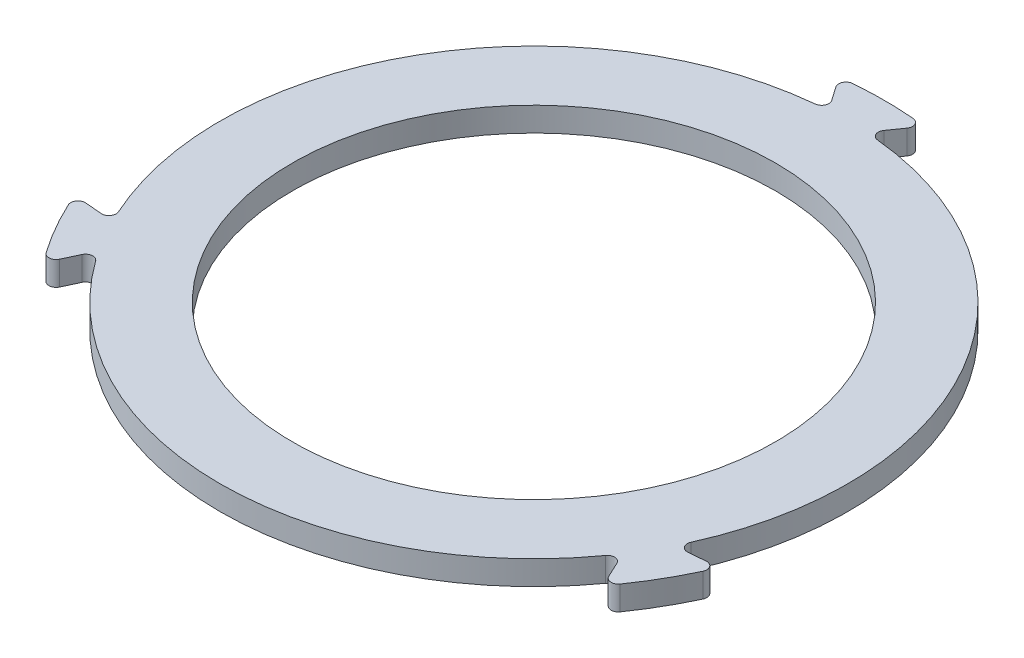
ISO-10303-21;
HEADER;
FILE_DESCRIPTION(('STEP AP214'),'2;1');
FILE_NAME('part.step','',(''),(''),'','','');
FILE_SCHEMA(('AUTOMOTIVE_DESIGN { 1 0 10303 214 1 1 1 1 }'));
ENDSEC;
DATA;
#1=APPLICATION_CONTEXT('core data for automotive mechanical design processes');
#2=APPLICATION_PROTOCOL_DEFINITION('international standard','automotive_design',2000,#1);
#3=PRODUCT_CONTEXT('',#1,'mechanical');
#4=PRODUCT('Part','Part','',(#3));
#5=PRODUCT_RELATED_PRODUCT_CATEGORY('part','',(#4));
#6=PRODUCT_DEFINITION_FORMATION('','',#4);
#7=PRODUCT_DEFINITION_CONTEXT('part definition',#1,'design');
#8=PRODUCT_DEFINITION('design','',#6,#7);
#9=PRODUCT_DEFINITION_SHAPE('','',#8);
#10=(LENGTH_UNIT() NAMED_UNIT(*) SI_UNIT(.MILLI.,.METRE.));
#11=(NAMED_UNIT(*) PLANE_ANGLE_UNIT() SI_UNIT($,.RADIAN.));
#12=(NAMED_UNIT(*) SI_UNIT($,.STERADIAN.) SOLID_ANGLE_UNIT());
#13=UNCERTAINTY_MEASURE_WITH_UNIT(LENGTH_MEASURE(1.E-05),#10,'distance_accuracy_value','');
#14=(GEOMETRIC_REPRESENTATION_CONTEXT(3) GLOBAL_UNCERTAINTY_ASSIGNED_CONTEXT((#13)) GLOBAL_UNIT_ASSIGNED_CONTEXT((#10,
#11,#12)) REPRESENTATION_CONTEXT('',''));
#15=CARTESIAN_POINT('',(0.,0.,0.));
#16=DIRECTION('',(0.,0.,1.));
#17=DIRECTION('',(1.,0.,0.));
#18=AXIS2_PLACEMENT_3D('',#15,#16,#17);
#19=CARTESIAN_POINT('',(0.,-0.750000000000001,0.));
#20=DIRECTION('',(0.,-1.,0.));
#21=DIRECTION('',(0.,0.,-1.));
#22=AXIS2_PLACEMENT_3D('',#19,#20,#21);
#23=CYLINDRICAL_SURFACE('',#22,65.);
#24=CARTESIAN_POINT('',(0.,5.,0.));
#25=DIRECTION('',(0.,-1.,0.));
#26=DIRECTION('',(0.,0.,-1.));
#27=AXIS2_PLACEMENT_3D('',#24,#25,#26);
#28=CIRCLE('',#27,65.);
#29=CARTESIAN_POINT('',(6.46386338980305,5.,-64.6778050808619));
#30=VERTEX_POINT('',#29);
#31=CARTESIAN_POINT('',(59.2445539559464,5.,26.7410326382688));
#32=VERTEX_POINT('',#31);
#33=EDGE_CURVE('E343',#30,#32,#28,.T.);
#34=ORIENTED_EDGE('',*,*,#33,.T.);
#35=DIRECTION('',(0.,-1.,0.));
#36=VECTOR('',#35,1.);
#37=CARTESIAN_POINT('',(59.2445539559464,-0.750000000000001,26.7410326382688));
#38=LINE('',#37,#36);
#39=CARTESIAN_POINT('',(59.2445539559464,0.,26.7410326382688));
#40=VERTEX_POINT('',#39);
#41=EDGE_CURVE('E298',#32,#40,#38,.T.);
#42=ORIENTED_EDGE('',*,*,#41,.T.);
#43=CARTESIAN_POINT('',(0.,0.,0.));
#44=DIRECTION('',(0.,-1.,0.));
#45=DIRECTION('',(0.,0.,-1.));
#46=AXIS2_PLACEMENT_3D('',#43,#44,#45);
#47=CIRCLE('',#46,65.);
#48=CARTESIAN_POINT('',(6.46386338980305,0.,-64.6778050808619));
#49=VERTEX_POINT('',#48);
#50=EDGE_CURVE('E226',#49,#40,#47,.T.);
#51=ORIENTED_EDGE('',*,*,#50,.F.);
#52=DIRECTION('',(0.,-1.,0.));
#53=VECTOR('',#52,1.);
#54=CARTESIAN_POINT('',(6.46386338980305,-0.750000000000001,-64.6778050808619));
#55=LINE('',#54,#53);
#56=EDGE_CURVE('E223',#49,#30,#55,.F.);
#57=ORIENTED_EDGE('',*,*,#56,.T.);
#58=EDGE_LOOP('',(#34,#42,#51,#57));
#59=FACE_BOUND('',#58,.T.);
#60=ADVANCED_FACE('F32',(#59),#23,.T.);
#61=CARTESIAN_POINT('',(52.7806905661435,0.,37.9367724425921));
#62=VERTEX_POINT('',#61);
#63=CARTESIAN_POINT('',(-52.7806905661429,0.,37.9367724425928));
#64=VERTEX_POINT('',#63);
#65=EDGE_CURVE('E338',#62,#64,#47,.T.);
#66=ORIENTED_EDGE('',*,*,#65,.F.);
#67=DIRECTION('',(0.,-1.,0.));
#68=VECTOR('',#67,1.);
#69=CARTESIAN_POINT('',(52.7806905661435,-0.750000000000001,37.9367724425921));
#70=LINE('',#69,#68);
#71=CARTESIAN_POINT('',(52.7806905661435,5.,37.9367724425921));
#72=VERTEX_POINT('',#71);
#73=EDGE_CURVE('E317',#62,#72,#70,.F.);
#74=ORIENTED_EDGE('',*,*,#73,.T.);
#75=CARTESIAN_POINT('',(-52.7806905661429,5.,37.9367724425928));
#76=VERTEX_POINT('',#75);
#77=EDGE_CURVE('E327',#72,#76,#28,.T.);
#78=ORIENTED_EDGE('',*,*,#77,.T.);
#79=DIRECTION('',(0.,-1.,0.));
#80=VECTOR('',#79,1.);
#81=CARTESIAN_POINT('',(-52.7806905661429,-0.750000000000001,37.9367724425928));
#82=LINE('',#81,#80);
#83=EDGE_CURVE('E260',#76,#64,#82,.T.);
#84=ORIENTED_EDGE('',*,*,#83,.T.);
#85=EDGE_LOOP('',(#66,#74,#78,#84));
#86=FACE_BOUND('',#85,.T.);
#87=ADVANCED_FACE('F337',(#86),#23,.T.);
#88=CARTESIAN_POINT('',(0.,-0.750000000000001,0.));
#89=DIRECTION('',(0.,-1.,0.));
#90=DIRECTION('',(0.,0.,-1.));
#91=AXIS2_PLACEMENT_3D('',#88,#89,#90);
#92=CYLINDRICAL_SURFACE('',#91,50.);
#93=CARTESIAN_POINT('',(0.,5.,0.));
#94=DIRECTION('',(0.,-1.,0.));
#95=DIRECTION('',(0.,0.,-1.));
#96=AXIS2_PLACEMENT_3D('',#93,#94,#95);
#97=CIRCLE('',#96,50.);
#98=CARTESIAN_POINT('',(0.,5.,-50.));
#99=VERTEX_POINT('',#98);
#100=EDGE_CURVE('E348',#99,#99,#97,.T.);
#101=ORIENTED_EDGE('',*,*,#100,.F.);
#102=EDGE_LOOP('',(#101));
#103=FACE_BOUND('',#102,.T.);
#104=CARTESIAN_POINT('',(0.,0.,0.));
#105=DIRECTION('',(0.,-1.,0.));
#106=DIRECTION('',(0.,0.,-1.));
#107=AXIS2_PLACEMENT_3D('',#104,#105,#106);
#108=CIRCLE('',#107,50.);
#109=CARTESIAN_POINT('',(0.,0.,-50.));
#110=VERTEX_POINT('',#109);
#111=EDGE_CURVE('E221',#110,#110,#108,.T.);
#112=ORIENTED_EDGE('',*,*,#111,.T.);
#113=EDGE_LOOP('',(#112));
#114=FACE_BOUND('',#113,.T.);
#115=ADVANCED_FACE('F484',(#103,#114),#92,.F.);
#116=CARTESIAN_POINT('',(0.,0.,50.));
#117=DIRECTION('',(0.,1.,0.));
#118=DIRECTION('',(0.,0.,1.));
#119=AXIS2_PLACEMENT_3D('',#116,#117,#118);
#120=PLANE('',#119);
#121=ORIENTED_EDGE('',*,*,#111,.F.);
#122=EDGE_LOOP('',(#121));
#123=FACE_BOUND('',#122,.T.);
#124=DIRECTION('',(-0.996194698091745,0.,0.0871557427476622));
#125=VECTOR('',#124,1.);
#126=CARTESIAN_POINT('',(58.1317926992566,0.,29.0808300701796));
#127=LINE('',#126,#125);
#128=CARTESIAN_POINT('',(64.1992009210775,0.,28.5500006337862));
#129=VERTEX_POINT('',#128);
#130=CARTESIAN_POINT('',(60.7424695844359,0.,28.8524254385972));
#131=VERTEX_POINT('',#130);
#132=EDGE_CURVE('E373',#129,#131,#127,.T.);
#133=ORIENTED_EDGE('',*,*,#132,.F.);
#134=CARTESIAN_POINT('',(64.329934535199,0.,30.0442926809239));
#135=DIRECTION('',(0.,1.,0.));
#136=DIRECTION('',(0.,0.,1.));
#137=AXIS2_PLACEMENT_3D('',#134,#135,#136);
#138=CIRCLE('',#137,1.5);
#139=CARTESIAN_POINT('',(65.6890176591821,0.,30.6790312586899));
#140=VERTEX_POINT('',#139);
#141=EDGE_CURVE('E310',#129,#140,#138,.F.);
#142=ORIENTED_EDGE('',*,*,#141,.T.);
#143=CARTESIAN_POINT('',(0.,0.,0.));
#144=DIRECTION('',(0.,1.,0.));
#145=DIRECTION('',(0.866025403784443,0.,0.499999999999992));
#146=AXIS2_PLACEMENT_3D('',#143,#144,#145);
#147=CIRCLE('',#146,72.5);
#148=CARTESIAN_POINT('',(59.4133292631141,0.,41.5488424131503));
#149=VERTEX_POINT('',#148);
#150=EDGE_CURVE('E388',#149,#140,#147,.T.);
#151=ORIENTED_EDGE('',*,*,#150,.F.);
#152=CARTESIAN_POINT('',(58.1840879680152,0.,40.6892111908092));
#153=DIRECTION('',(0.,1.,0.));
#154=DIRECTION('',(0.,0.,1.));
#155=AXIS2_PLACEMENT_3D('',#152,#153,#154);
#156=CIRCLE('',#155,1.5);
#157=CARTESIAN_POINT('',(56.8246262874602,0.,41.3231385834203));
#158=VERTEX_POINT('',#157);
#159=EDGE_CURVE('E51',#149,#158,#156,.F.);
#160=ORIENTED_EDGE('',*,*,#159,.T.);
#161=DIRECTION('',(0.422618261740713,0.,0.906307787036644));
#162=VECTOR('',#161,1.);
#163=CARTESIAN_POINT('',(57.9010744784291,0.,43.631589178523));
#164=LINE('',#163,#162);
#165=CARTESIAN_POINT('',(55.3581681828402,0.,38.1783090294255));
#166=VERTEX_POINT('',#165);
#167=EDGE_CURVE('E384',#166,#158,#164,.T.);
#168=ORIENTED_EDGE('',*,*,#167,.F.);
#169=CARTESIAN_POINT('',(53.9987065022852,0.,38.8122364220365));
#170=DIRECTION('',(0.,1.,0.));
#171=DIRECTION('',(0.,0.,1.));
#172=AXIS2_PLACEMENT_3D('',#169,#170,#171);
#173=CIRCLE('',#172,1.5);
#174=EDGE_CURVE('E11',#166,#62,#173,.T.);
#175=ORIENTED_EDGE('',*,*,#174,.T.);
#176=ORIENTED_EDGE('',*,*,#65,.T.);
#177=CARTESIAN_POINT('',(-53.9987065022847,0.,38.8122364220373));
#178=DIRECTION('',(0.,1.,0.));
#179=DIRECTION('',(0.,0.,1.));
#180=AXIS2_PLACEMENT_3D('',#177,#178,#179);
#181=CIRCLE('',#180,1.5);
#182=CARTESIAN_POINT('',(-55.3581681828397,0.,38.1783090294262));
#183=VERTEX_POINT('',#182);
#184=EDGE_CURVE('E287',#64,#183,#181,.T.);
#185=ORIENTED_EDGE('',*,*,#184,.T.);
#186=DIRECTION('',(0.4226182617407,0.,-0.90630778703665));
#187=VECTOR('',#186,1.);
#188=CARTESIAN_POINT('',(-54.2506339535424,0.,35.8031942099969));
#189=LINE('',#188,#187);
#190=CARTESIAN_POINT('',(-56.8246262874596,0.,41.3231385834211));
#191=VERTEX_POINT('',#190);
#192=EDGE_CURVE('E356',#191,#183,#189,.T.);
#193=ORIENTED_EDGE('',*,*,#192,.F.);
#194=CARTESIAN_POINT('',(-58.1840879680146,0.,40.68921119081));
#195=DIRECTION('',(0.,1.,0.));
#196=DIRECTION('',(0.,0.,1.));
#197=AXIS2_PLACEMENT_3D('',#194,#195,#196);
#198=CIRCLE('',#197,1.5);
#199=CARTESIAN_POINT('',(-59.4133292631135,0.,41.5488424131511));
#200=VERTEX_POINT('',#199);
#201=EDGE_CURVE('E274',#191,#200,#198,.F.);
#202=ORIENTED_EDGE('',*,*,#201,.T.);
#203=CARTESIAN_POINT('',(0.,0.,0.));
#204=DIRECTION('',(0.,1.,0.));
#205=DIRECTION('',(-0.866025403784436,0.,0.500000000000004));
#206=AXIS2_PLACEMENT_3D('',#203,#204,#205);
#207=CIRCLE('',#206,72.5);
#208=CARTESIAN_POINT('',(-65.6890176591816,0.,30.6790312586908));
#209=VERTEX_POINT('',#208);
#210=EDGE_CURVE('E376',#209,#200,#207,.T.);
#211=ORIENTED_EDGE('',*,*,#210,.F.);
#212=CARTESIAN_POINT('',(-64.3299345351986,0.,30.0442926809248));
#213=DIRECTION('',(0.,1.,0.));
#214=DIRECTION('',(0.,0.,1.));
#215=AXIS2_PLACEMENT_3D('',#212,#213,#214);
#216=CIRCLE('',#215,1.5);
#217=CARTESIAN_POINT('',(-64.1992009210771,0.,28.5500006337871));
#218=VERTEX_POINT('',#217);
#219=EDGE_CURVE('E272',#209,#218,#216,.F.);
#220=ORIENTED_EDGE('',*,*,#219,.T.);
#221=DIRECTION('',(-0.996194698091747,0.,-0.0871557427476483));
#222=VECTOR('',#221,1.);
#223=CARTESIAN_POINT('',(-66.7366018753018,0.,28.3280068154726));
#224=LINE('',#223,#222);
#225=CARTESIAN_POINT('',(-60.7424695844355,0.,28.8524254385981));
#226=VERTEX_POINT('',#225);
#227=EDGE_CURVE('E366',#226,#218,#224,.T.);
#228=ORIENTED_EDGE('',*,*,#227,.F.);
#229=CARTESIAN_POINT('',(-60.611735970314,0.,27.3581333914604));
#230=DIRECTION('',(0.,1.,0.));
#231=DIRECTION('',(0.,0.,1.));
#232=AXIS2_PLACEMENT_3D('',#229,#230,#231);
#233=CIRCLE('',#232,1.5);
#234=CARTESIAN_POINT('',(-59.244553955946,0.,26.7410326382696));
#235=VERTEX_POINT('',#234);
#236=EDGE_CURVE('E291',#226,#235,#233,.T.);
#237=ORIENTED_EDGE('',*,*,#236,.T.);
#238=CARTESIAN_POINT('',(-6.46386338980305,0.,-64.6778050808619));
#239=VERTEX_POINT('',#238);
#240=EDGE_CURVE('E341',#235,#239,#47,.T.);
#241=ORIENTED_EDGE('',*,*,#240,.T.);
#242=CARTESIAN_POINT('',(-6.61302946802927,0.,-66.1703698134972));
#243=DIRECTION('',(0.,1.,0.));
#244=DIRECTION('',(0.,0.,1.));
#245=AXIS2_PLACEMENT_3D('',#242,#243,#244);
#246=CIRCLE('',#245,1.5);
#247=CARTESIAN_POINT('',(-5.38430140159578,0.,-67.0307344680237));
#248=VERTEX_POINT('',#247);
#249=EDGE_CURVE('E249',#239,#248,#246,.T.);
#250=ORIENTED_EDGE('',*,*,#249,.T.);
#251=DIRECTION('',(0.573576436351042,0.,0.819152044288995));
#252=VECTOR('',#251,1.);
#253=CARTESIAN_POINT('',(-3.88115874571378,0.,-64.8840242801768));
#254=LINE('',#253,#252);
#255=CARTESIAN_POINT('',(-7.37457463361741,0.,-69.8731392172076));
#256=VERTEX_POINT('',#255);
#257=EDGE_CURVE('E350',#256,#248,#254,.T.);
#258=ORIENTED_EDGE('',*,*,#257,.F.);
#259=CARTESIAN_POINT('',(-6.14584656718391,0.,-70.7335038717342));
#260=DIRECTION('',(0.,1.,0.));
#261=DIRECTION('',(0.,0.,1.));
#262=AXIS2_PLACEMENT_3D('',#259,#260,#261);
#263=CIRCLE('',#262,1.5);
#264=CARTESIAN_POINT('',(-6.27568839606808,0.,-72.2278736718413));
#265=VERTEX_POINT('',#264);
#266=EDGE_CURVE('E220',#256,#265,#263,.F.);
#267=ORIENTED_EDGE('',*,*,#266,.T.);
#268=CARTESIAN_POINT('',(0.,0.,0.));
#269=DIRECTION('',(0.,1.,0.));
#270=DIRECTION('',(0.,0.,-1.));
#271=AXIS2_PLACEMENT_3D('',#268,#269,#270);
#272=CIRCLE('',#271,72.5);
#273=CARTESIAN_POINT('',(6.27568839606808,0.,-72.2278736718413));
#274=VERTEX_POINT('',#273);
#275=EDGE_CURVE('E358',#274,#265,#272,.T.);
#276=ORIENTED_EDGE('',*,*,#275,.F.);
#277=CARTESIAN_POINT('',(6.14584656718391,0.,-70.7335038717342));
#278=DIRECTION('',(0.,1.,0.));
#279=DIRECTION('',(0.,0.,1.));
#280=AXIS2_PLACEMENT_3D('',#277,#278,#279);
#281=CIRCLE('',#280,1.5);
#282=CARTESIAN_POINT('',(7.37457463361741,0.,-69.8731392172076));
#283=VERTEX_POINT('',#282);
#284=EDGE_CURVE('E205',#274,#283,#281,.F.);
#285=ORIENTED_EDGE('',*,*,#284,.T.);
#286=DIRECTION('',(0.573576436351042,0.,-0.819152044288995));
#287=VECTOR('',#286,1.);
#288=CARTESIAN_POINT('',(8.83552739687324,0.,-71.9595959939959));
#289=LINE('',#288,#287);
#290=CARTESIAN_POINT('',(5.38430140159578,0.,-67.0307344680237));
#291=VERTEX_POINT('',#290);
#292=EDGE_CURVE('E216',#291,#283,#289,.T.);
#293=ORIENTED_EDGE('',*,*,#292,.F.);
#294=CARTESIAN_POINT('',(6.61302946802927,0.,-66.1703698134972));
#295=DIRECTION('',(0.,1.,0.));
#296=DIRECTION('',(0.,0.,1.));
#297=AXIS2_PLACEMENT_3D('',#294,#295,#296);
#298=CIRCLE('',#297,1.5);
#299=EDGE_CURVE('E253',#291,#49,#298,.T.);
#300=ORIENTED_EDGE('',*,*,#299,.T.);
#301=ORIENTED_EDGE('',*,*,#50,.T.);
#302=CARTESIAN_POINT('',(60.6117359703144,0.,27.3581333914596));
#303=DIRECTION('',(0.,1.,0.));
#304=DIRECTION('',(0.,0.,1.));
#305=AXIS2_PLACEMENT_3D('',#302,#303,#304);
#306=CIRCLE('',#305,1.5);
#307=EDGE_CURVE('E322',#40,#131,#306,.T.);
#308=ORIENTED_EDGE('',*,*,#307,.T.);
#309=EDGE_LOOP('',(#133,#142,#151,#160,#168,#175,#176,#185,#193,#202,#211,#220,#228,#237,#241,
#250,#258,#267,#276,#285,#293,#300,#301,#308));
#310=FACE_BOUND('',#309,.T.);
#311=ADVANCED_FACE('F431',(#123,#310),#120,.F.);
#312=ORIENTED_EDGE('',*,*,#240,.F.);
#313=DIRECTION('',(0.,-1.,0.));
#314=VECTOR('',#313,1.);
#315=CARTESIAN_POINT('',(-59.244553955946,-0.750000000000001,26.7410326382696));
#316=LINE('',#315,#314);
#317=CARTESIAN_POINT('',(-59.244553955946,5.,26.7410326382696));
#318=VERTEX_POINT('',#317);
#319=EDGE_CURVE('E281',#235,#318,#316,.F.);
#320=ORIENTED_EDGE('',*,*,#319,.T.);
#321=CARTESIAN_POINT('',(-6.46386338980305,5.,-64.6778050808619));
#322=VERTEX_POINT('',#321);
#323=EDGE_CURVE('E347',#318,#322,#28,.T.);
#324=ORIENTED_EDGE('',*,*,#323,.T.);
#325=DIRECTION('',(0.,-1.,0.));
#326=VECTOR('',#325,1.);
#327=CARTESIAN_POINT('',(-6.46386338980305,-0.750000000000001,-64.6778050808619));
#328=LINE('',#327,#326);
#329=EDGE_CURVE('E232',#322,#239,#328,.T.);
#330=ORIENTED_EDGE('',*,*,#329,.T.);
#331=EDGE_LOOP('',(#312,#320,#324,#330));
#332=FACE_BOUND('',#331,.T.);
#333=ADVANCED_FACE('F440',(#332),#23,.T.);
#334=CARTESIAN_POINT('',(0.,5.,65.));
#335=DIRECTION('',(0.,-1.,0.));
#336=DIRECTION('',(0.,0.,-1.));
#337=AXIS2_PLACEMENT_3D('',#334,#335,#336);
#338=PLANE('',#337);
#339=CARTESIAN_POINT('',(0.,5.,0.));
#340=DIRECTION('',(0.,1.,0.));
#341=DIRECTION('',(0.866025403784443,0.,0.499999999999992));
#342=AXIS2_PLACEMENT_3D('',#339,#340,#341);
#343=CIRCLE('',#342,72.5);
#344=CARTESIAN_POINT('',(59.4133292631141,5.,41.5488424131503));
#345=VERTEX_POINT('',#344);
#346=CARTESIAN_POINT('',(65.6890176591821,5.,30.6790312586899));
#347=VERTEX_POINT('',#346);
#348=EDGE_CURVE('E334',#345,#347,#343,.T.);
#349=ORIENTED_EDGE('',*,*,#348,.T.);
#350=CARTESIAN_POINT('',(64.329934535199,5.,30.0442926809239));
#351=DIRECTION('',(0.,-1.,0.));
#352=DIRECTION('',(0.,0.,-1.));
#353=AXIS2_PLACEMENT_3D('',#350,#351,#352);
#354=CIRCLE('',#353,1.5);
#355=CARTESIAN_POINT('',(64.1992009210775,5.,28.5500006337862));
#356=VERTEX_POINT('',#355);
#357=EDGE_CURVE('E307',#347,#356,#354,.F.);
#358=ORIENTED_EDGE('',*,*,#357,.T.);
#359=DIRECTION('',(-0.996194698091745,0.,0.0871557427476622));
#360=VECTOR('',#359,1.);
#361=CARTESIAN_POINT('',(58.1317926992566,5.,29.0808300701796));
#362=LINE('',#361,#360);
#363=CARTESIAN_POINT('',(60.7424695844359,5.,28.8524254385972));
#364=VERTEX_POINT('',#363);
#365=EDGE_CURVE('E381',#356,#364,#362,.T.);
#366=ORIENTED_EDGE('',*,*,#365,.T.);
#367=CARTESIAN_POINT('',(60.6117359703144,5.,27.3581333914596));
#368=DIRECTION('',(0.,-1.,0.));
#369=DIRECTION('',(0.,0.,-1.));
#370=AXIS2_PLACEMENT_3D('',#367,#368,#369);
#371=CIRCLE('',#370,1.5);
#372=EDGE_CURVE('E320',#364,#32,#371,.T.);
#373=ORIENTED_EDGE('',*,*,#372,.T.);
#374=ORIENTED_EDGE('',*,*,#33,.F.);
#375=CARTESIAN_POINT('',(6.61302946802927,5.,-66.1703698134972));
#376=DIRECTION('',(0.,-1.,0.));
#377=DIRECTION('',(0.,0.,-1.));
#378=AXIS2_PLACEMENT_3D('',#375,#376,#377);
#379=CIRCLE('',#378,1.5);
#380=CARTESIAN_POINT('',(5.38430140159578,5.,-67.0307344680237));
#381=VERTEX_POINT('',#380);
#382=EDGE_CURVE('E251',#30,#381,#379,.T.);
#383=ORIENTED_EDGE('',*,*,#382,.T.);
#384=DIRECTION('',(0.573576436351042,0.,-0.819152044288995));
#385=VECTOR('',#384,1.);
#386=CARTESIAN_POINT('',(8.83552739687324,5.,-71.9595959939959));
#387=LINE('',#386,#385);
#388=CARTESIAN_POINT('',(7.37457463361741,5.,-69.8731392172076));
#389=VERTEX_POINT('',#388);
#390=EDGE_CURVE('E353',#381,#389,#387,.T.);
#391=ORIENTED_EDGE('',*,*,#390,.T.);
#392=CARTESIAN_POINT('',(6.14584656718391,5.,-70.7335038717342));
#393=DIRECTION('',(0.,-1.,0.));
#394=DIRECTION('',(0.,0.,-1.));
#395=AXIS2_PLACEMENT_3D('',#392,#393,#394);
#396=CIRCLE('',#395,1.5);
#397=CARTESIAN_POINT('',(6.27568839606808,5.,-72.2278736718413));
#398=VERTEX_POINT('',#397);
#399=EDGE_CURVE('E206',#389,#398,#396,.F.);
#400=ORIENTED_EDGE('',*,*,#399,.T.);
#401=CARTESIAN_POINT('',(0.,5.,0.));
#402=DIRECTION('',(0.,1.,0.));
#403=DIRECTION('',(0.,0.,-1.));
#404=AXIS2_PLACEMENT_3D('',#401,#402,#403);
#405=CIRCLE('',#404,72.5);
#406=CARTESIAN_POINT('',(-6.27568839606808,5.,-72.2278736718413));
#407=VERTEX_POINT('',#406);
#408=EDGE_CURVE('E200',#398,#407,#405,.T.);
#409=ORIENTED_EDGE('',*,*,#408,.T.);
#410=CARTESIAN_POINT('',(-6.14584656718391,5.,-70.7335038717342));
#411=DIRECTION('',(0.,-1.,0.));
#412=DIRECTION('',(0.,0.,-1.));
#413=AXIS2_PLACEMENT_3D('',#410,#411,#412);
#414=CIRCLE('',#413,1.5);
#415=CARTESIAN_POINT('',(-7.37457463361741,5.,-69.8731392172076));
#416=VERTEX_POINT('',#415);
#417=EDGE_CURVE('E192',#407,#416,#414,.F.);
#418=ORIENTED_EDGE('',*,*,#417,.T.);
#419=DIRECTION('',(0.573576436351042,0.,0.819152044288995));
#420=VECTOR('',#419,1.);
#421=CARTESIAN_POINT('',(-3.88115874571378,5.,-64.8840242801768));
#422=LINE('',#421,#420);
#423=CARTESIAN_POINT('',(-5.38430140159578,5.,-67.0307344680237));
#424=VERTEX_POINT('',#423);
#425=EDGE_CURVE('E198',#416,#424,#422,.T.);
#426=ORIENTED_EDGE('',*,*,#425,.T.);
#427=CARTESIAN_POINT('',(-6.61302946802927,5.,-66.1703698134972));
#428=DIRECTION('',(0.,-1.,0.));
#429=DIRECTION('',(0.,0.,-1.));
#430=AXIS2_PLACEMENT_3D('',#427,#428,#429);
#431=CIRCLE('',#430,1.5);
#432=EDGE_CURVE('E247',#424,#322,#431,.T.);
#433=ORIENTED_EDGE('',*,*,#432,.T.);
#434=ORIENTED_EDGE('',*,*,#323,.F.);
#435=CARTESIAN_POINT('',(-60.611735970314,5.,27.3581333914604));
#436=DIRECTION('',(0.,-1.,0.));
#437=DIRECTION('',(0.,0.,-1.));
#438=AXIS2_PLACEMENT_3D('',#435,#436,#437);
#439=CIRCLE('',#438,1.5);
#440=CARTESIAN_POINT('',(-60.7424695844355,5.,28.8524254385981));
#441=VERTEX_POINT('',#440);
#442=EDGE_CURVE('E289',#318,#441,#439,.T.);
#443=ORIENTED_EDGE('',*,*,#442,.T.);
#444=DIRECTION('',(-0.996194698091747,0.,-0.0871557427476483));
#445=VECTOR('',#444,1.);
#446=CARTESIAN_POINT('',(-66.7366018753018,5.,28.3280068154726));
#447=LINE('',#446,#445);
#448=CARTESIAN_POINT('',(-64.1992009210771,5.,28.5500006337871));
#449=VERTEX_POINT('',#448);
#450=EDGE_CURVE('E370',#441,#449,#447,.T.);
#451=ORIENTED_EDGE('',*,*,#450,.T.);
#452=CARTESIAN_POINT('',(-64.3299345351986,5.,30.0442926809248));
#453=DIRECTION('',(0.,-1.,0.));
#454=DIRECTION('',(0.,0.,-1.));
#455=AXIS2_PLACEMENT_3D('',#452,#453,#454);
#456=CIRCLE('',#455,1.5);
#457=CARTESIAN_POINT('',(-65.6890176591816,5.,30.6790312586908));
#458=VERTEX_POINT('',#457);
#459=EDGE_CURVE('E268',#449,#458,#456,.F.);
#460=ORIENTED_EDGE('',*,*,#459,.T.);
#461=CARTESIAN_POINT('',(0.,5.,0.));
#462=DIRECTION('',(0.,1.,0.));
#463=DIRECTION('',(-0.866025403784436,0.,0.500000000000004));
#464=AXIS2_PLACEMENT_3D('',#461,#462,#463);
#465=CIRCLE('',#464,72.5);
#466=CARTESIAN_POINT('',(-59.4133292631135,5.,41.5488424131511));
#467=VERTEX_POINT('',#466);
#468=EDGE_CURVE('E367',#458,#467,#465,.T.);
#469=ORIENTED_EDGE('',*,*,#468,.T.);
#470=CARTESIAN_POINT('',(-58.1840879680146,5.,40.68921119081));
#471=DIRECTION('',(0.,-1.,0.));
#472=DIRECTION('',(0.,0.,-1.));
#473=AXIS2_PLACEMENT_3D('',#470,#471,#472);
#474=CIRCLE('',#473,1.5);
#475=CARTESIAN_POINT('',(-56.8246262874596,5.,41.3231385834211));
#476=VERTEX_POINT('',#475);
#477=EDGE_CURVE('E270',#467,#476,#474,.F.);
#478=ORIENTED_EDGE('',*,*,#477,.T.);
#479=DIRECTION('',(0.4226182617407,0.,-0.90630778703665));
#480=VECTOR('',#479,1.);
#481=CARTESIAN_POINT('',(-54.2506339535424,5.,35.8031942099969));
#482=LINE('',#481,#480);
#483=CARTESIAN_POINT('',(-55.3581681828397,5.,38.1783090294262));
#484=VERTEX_POINT('',#483);
#485=EDGE_CURVE('E363',#476,#484,#482,.T.);
#486=ORIENTED_EDGE('',*,*,#485,.T.);
#487=CARTESIAN_POINT('',(-53.9987065022847,5.,38.8122364220373));
#488=DIRECTION('',(0.,-1.,0.));
#489=DIRECTION('',(0.,0.,-1.));
#490=AXIS2_PLACEMENT_3D('',#487,#488,#489);
#491=CIRCLE('',#490,1.5);
#492=EDGE_CURVE('E284',#484,#76,#491,.T.);
#493=ORIENTED_EDGE('',*,*,#492,.T.);
#494=ORIENTED_EDGE('',*,*,#77,.F.);
#495=CARTESIAN_POINT('',(53.9987065022852,5.,38.8122364220365));
#496=DIRECTION('',(0.,-1.,0.));
#497=DIRECTION('',(0.,0.,-1.));
#498=AXIS2_PLACEMENT_3D('',#495,#496,#497);
#499=CIRCLE('',#498,1.5);
#500=CARTESIAN_POINT('',(55.3581681828402,5.,38.1783090294255));
#501=VERTEX_POINT('',#500);
#502=EDGE_CURVE('E40',#72,#501,#499,.T.);
#503=ORIENTED_EDGE('',*,*,#502,.T.);
#504=DIRECTION('',(0.422618261740713,0.,0.906307787036644));
#505=VECTOR('',#504,1.);
#506=CARTESIAN_POINT('',(57.9010744784291,5.,43.631589178523));
#507=LINE('',#506,#505);
#508=CARTESIAN_POINT('',(56.8246262874602,5.,41.3231385834203));
#509=VERTEX_POINT('',#508);
#510=EDGE_CURVE('E326',#501,#509,#507,.T.);
#511=ORIENTED_EDGE('',*,*,#510,.T.);
#512=CARTESIAN_POINT('',(58.1840879680152,5.,40.6892111908092));
#513=DIRECTION('',(0.,-1.,0.));
#514=DIRECTION('',(0.,0.,-1.));
#515=AXIS2_PLACEMENT_3D('',#512,#513,#514);
#516=CIRCLE('',#515,1.5);
#517=EDGE_CURVE('E305',#509,#345,#516,.F.);
#518=ORIENTED_EDGE('',*,*,#517,.T.);
#519=EDGE_LOOP('',(#349,#358,#366,#373,#374,#383,#391,#400,#409,#418,#426,#433,#434,#443,#451,
#460,#469,#478,#486,#493,#494,#503,#511,#518));
#520=FACE_BOUND('',#519,.T.);
#521=ORIENTED_EDGE('',*,*,#100,.T.);
#522=EDGE_LOOP('',(#521));
#523=FACE_BOUND('',#522,.T.);
#524=ADVANCED_FACE('F195',(#520,#523),#338,.F.);
#525=CARTESIAN_POINT('',(-3.88115874571378,0.,-64.8840242801768));
#526=DIRECTION('',(-0.819152044288995,0.,0.573576436351042));
#527=DIRECTION('',(0.573576436351042,0.,0.819152044288995));
#528=AXIS2_PLACEMENT_3D('',#525,#526,#527);
#529=PLANE('',#528);
#530=ORIENTED_EDGE('',*,*,#257,.T.);
#531=DIRECTION('',(0.,-1.,0.));
#532=VECTOR('',#531,1.);
#533=CARTESIAN_POINT('',(-5.38430140159578,0.,-67.0307344680237));
#534=LINE('',#533,#532);
#535=EDGE_CURVE('E215',#248,#424,#534,.F.);
#536=ORIENTED_EDGE('',*,*,#535,.T.);
#537=ORIENTED_EDGE('',*,*,#425,.F.);
#538=DIRECTION('',(0.,1.,0.));
#539=VECTOR('',#538,1.);
#540=CARTESIAN_POINT('',(-7.37457463361741,0.,-69.8731392172076));
#541=LINE('',#540,#539);
#542=EDGE_CURVE('E212',#416,#256,#541,.F.);
#543=ORIENTED_EDGE('',*,*,#542,.T.);
#544=EDGE_LOOP('',(#530,#536,#537,#543));
#545=FACE_BOUND('',#544,.T.);
#546=ADVANCED_FACE('F211',(#545),#529,.T.);
#547=CARTESIAN_POINT('',(0.,0.,0.));
#548=DIRECTION('',(0.,1.,0.));
#549=DIRECTION('',(0.,0.,1.));
#550=AXIS2_PLACEMENT_3D('',#547,#548,#549);
#551=CYLINDRICAL_SURFACE('',#550,72.5);
#552=ORIENTED_EDGE('',*,*,#275,.T.);
#553=DIRECTION('',(0.,1.,0.));
#554=VECTOR('',#553,1.);
#555=CARTESIAN_POINT('',(-6.27568839606808,0.,-72.2278736718413));
#556=LINE('',#555,#554);
#557=EDGE_CURVE('E237',#265,#407,#556,.T.);
#558=ORIENTED_EDGE('',*,*,#557,.T.);
#559=ORIENTED_EDGE('',*,*,#408,.F.);
#560=DIRECTION('',(0.,1.,0.));
#561=VECTOR('',#560,1.);
#562=CARTESIAN_POINT('',(6.27568839606808,0.,-72.2278736718413));
#563=LINE('',#562,#561);
#564=EDGE_CURVE('E235',#398,#274,#563,.F.);
#565=ORIENTED_EDGE('',*,*,#564,.T.);
#566=EDGE_LOOP('',(#552,#558,#559,#565));
#567=FACE_BOUND('',#566,.T.);
#568=ADVANCED_FACE('F429',(#567),#551,.T.);
#569=CARTESIAN_POINT('',(8.83552739687324,0.,-71.9595959939959));
#570=DIRECTION('',(0.819152044288995,0.,0.573576436351042));
#571=DIRECTION('',(0.573576436351042,0.,-0.819152044288995));
#572=AXIS2_PLACEMENT_3D('',#569,#570,#571);
#573=PLANE('',#572);
#574=ORIENTED_EDGE('',*,*,#292,.T.);
#575=DIRECTION('',(0.,1.,0.));
#576=VECTOR('',#575,1.);
#577=CARTESIAN_POINT('',(7.37457463361741,0.,-69.8731392172076));
#578=LINE('',#577,#576);
#579=EDGE_CURVE('E244',#283,#389,#578,.T.);
#580=ORIENTED_EDGE('',*,*,#579,.T.);
#581=ORIENTED_EDGE('',*,*,#390,.F.);
#582=DIRECTION('',(0.,-1.,0.));
#583=VECTOR('',#582,1.);
#584=CARTESIAN_POINT('',(5.38430140159578,0.,-67.0307344680237));
#585=LINE('',#584,#583);
#586=EDGE_CURVE('E242',#381,#291,#585,.T.);
#587=ORIENTED_EDGE('',*,*,#586,.T.);
#588=EDGE_LOOP('',(#574,#580,#581,#587));
#589=FACE_BOUND('',#588,.T.);
#590=ADVANCED_FACE('F421',(#589),#573,.T.);
#591=CARTESIAN_POINT('',(-6.61302946802927,-0.750000000000001,-66.1703698134972));
#592=DIRECTION('',(0.,-1.,0.));
#593=DIRECTION('',(0.,0.,-1.));
#594=AXIS2_PLACEMENT_3D('',#591,#592,#593);
#595=CYLINDRICAL_SURFACE('',#594,1.5);
#596=ORIENTED_EDGE('',*,*,#249,.F.);
#597=ORIENTED_EDGE('',*,*,#329,.F.);
#598=ORIENTED_EDGE('',*,*,#432,.F.);
#599=ORIENTED_EDGE('',*,*,#535,.F.);
#600=EDGE_LOOP('',(#596,#597,#598,#599));
#601=FACE_BOUND('',#600,.T.);
#602=ADVANCED_FACE('F434',(#601),#595,.F.);
#603=CARTESIAN_POINT('',(-6.14584656718391,0.,-70.7335038717342));
#604=DIRECTION('',(0.,1.,0.));
#605=DIRECTION('',(0.,0.,1.));
#606=AXIS2_PLACEMENT_3D('',#603,#604,#605);
#607=CYLINDRICAL_SURFACE('',#606,1.5);
#608=ORIENTED_EDGE('',*,*,#266,.F.);
#609=ORIENTED_EDGE('',*,*,#542,.F.);
#610=ORIENTED_EDGE('',*,*,#417,.F.);
#611=ORIENTED_EDGE('',*,*,#557,.F.);
#612=EDGE_LOOP('',(#608,#609,#610,#611));
#613=FACE_BOUND('',#612,.T.);
#614=ADVANCED_FACE('F219',(#613),#607,.T.);
#615=CARTESIAN_POINT('',(6.14584656718391,0.,-70.7335038717342));
#616=DIRECTION('',(0.,1.,0.));
#617=DIRECTION('',(0.,0.,1.));
#618=AXIS2_PLACEMENT_3D('',#615,#616,#617);
#619=CYLINDRICAL_SURFACE('',#618,1.5);
#620=ORIENTED_EDGE('',*,*,#284,.F.);
#621=ORIENTED_EDGE('',*,*,#564,.F.);
#622=ORIENTED_EDGE('',*,*,#399,.F.);
#623=ORIENTED_EDGE('',*,*,#579,.F.);
#624=EDGE_LOOP('',(#620,#621,#622,#623));
#625=FACE_BOUND('',#624,.T.);
#626=ADVANCED_FACE('F426',(#625),#619,.T.);
#627=CARTESIAN_POINT('',(6.61302946802927,-0.750000000000001,-66.1703698134972));
#628=DIRECTION('',(0.,-1.,0.));
#629=DIRECTION('',(0.,0.,-1.));
#630=AXIS2_PLACEMENT_3D('',#627,#628,#629);
#631=CYLINDRICAL_SURFACE('',#630,1.5);
#632=ORIENTED_EDGE('',*,*,#299,.F.);
#633=ORIENTED_EDGE('',*,*,#586,.F.);
#634=ORIENTED_EDGE('',*,*,#382,.F.);
#635=ORIENTED_EDGE('',*,*,#56,.F.);
#636=EDGE_LOOP('',(#632,#633,#634,#635));
#637=FACE_BOUND('',#636,.T.);
#638=ADVANCED_FACE('F417',(#637),#631,.F.);
#639=CARTESIAN_POINT('',(-54.2506339535424,0.,35.8031942099969));
#640=DIRECTION('',(0.90630778703665,0.,0.4226182617407));
#641=DIRECTION('',(0.4226182617407,0.,-0.90630778703665));
#642=AXIS2_PLACEMENT_3D('',#639,#640,#641);
#643=PLANE('',#642);
#644=ORIENTED_EDGE('',*,*,#192,.T.);
#645=DIRECTION('',(0.,-1.,0.));
#646=VECTOR('',#645,1.);
#647=CARTESIAN_POINT('',(-55.3581681828397,0.,38.1783090294262));
#648=LINE('',#647,#646);
#649=EDGE_CURVE('E257',#183,#484,#648,.F.);
#650=ORIENTED_EDGE('',*,*,#649,.T.);
#651=ORIENTED_EDGE('',*,*,#485,.F.);
#652=DIRECTION('',(0.,1.,0.));
#653=VECTOR('',#652,1.);
#654=CARTESIAN_POINT('',(-56.8246262874596,0.,41.3231385834211));
#655=LINE('',#654,#653);
#656=EDGE_CURVE('E255',#476,#191,#655,.F.);
#657=ORIENTED_EDGE('',*,*,#656,.T.);
#658=EDGE_LOOP('',(#644,#650,#651,#657));
#659=FACE_BOUND('',#658,.T.);
#660=ADVANCED_FACE('F465',(#659),#643,.T.);
#661=CARTESIAN_POINT('',(0.,0.,0.));
#662=DIRECTION('',(0.,1.,0.));
#663=DIRECTION('',(0.,0.,1.));
#664=AXIS2_PLACEMENT_3D('',#661,#662,#663);
#665=CYLINDRICAL_SURFACE('',#664,72.5);
#666=ORIENTED_EDGE('',*,*,#210,.T.);
#667=DIRECTION('',(0.,1.,0.));
#668=VECTOR('',#667,1.);
#669=CARTESIAN_POINT('',(-59.4133292631135,0.,41.5488424131511));
#670=LINE('',#669,#668);
#671=EDGE_CURVE('E265',#200,#467,#670,.T.);
#672=ORIENTED_EDGE('',*,*,#671,.T.);
#673=ORIENTED_EDGE('',*,*,#468,.F.);
#674=DIRECTION('',(0.,1.,0.));
#675=VECTOR('',#674,1.);
#676=CARTESIAN_POINT('',(-65.6890176591817,0.,30.6790312586908));
#677=LINE('',#676,#675);
#678=EDGE_CURVE('E263',#458,#209,#677,.F.);
#679=ORIENTED_EDGE('',*,*,#678,.T.);
#680=EDGE_LOOP('',(#666,#672,#673,#679));
#681=FACE_BOUND('',#680,.T.);
#682=ADVANCED_FACE('F457',(#681),#665,.T.);
#683=CARTESIAN_POINT('',(-66.7366018753018,0.,28.3280068154726));
#684=DIRECTION('',(0.0871557427476483,0.,-0.996194698091747));
#685=DIRECTION('',(-0.996194698091747,0.,-0.0871557427476483));
#686=AXIS2_PLACEMENT_3D('',#683,#684,#685);
#687=PLANE('',#686);
#688=ORIENTED_EDGE('',*,*,#227,.T.);
#689=DIRECTION('',(0.,1.,0.));
#690=VECTOR('',#689,1.);
#691=CARTESIAN_POINT('',(-64.1992009210771,0.,28.5500006337871));
#692=LINE('',#691,#690);
#693=EDGE_CURVE('E278',#218,#449,#692,.T.);
#694=ORIENTED_EDGE('',*,*,#693,.T.);
#695=ORIENTED_EDGE('',*,*,#450,.F.);
#696=DIRECTION('',(0.,-1.,0.));
#697=VECTOR('',#696,1.);
#698=CARTESIAN_POINT('',(-60.7424695844355,0.,28.8524254385981));
#699=LINE('',#698,#697);
#700=EDGE_CURVE('E276',#441,#226,#699,.T.);
#701=ORIENTED_EDGE('',*,*,#700,.T.);
#702=EDGE_LOOP('',(#688,#694,#695,#701));
#703=FACE_BOUND('',#702,.T.);
#704=ADVANCED_FACE('F448',(#703),#687,.T.);
#705=CARTESIAN_POINT('',(58.1317926992566,0.,29.0808300701796));
#706=DIRECTION('',(-0.0871557427476622,0.,-0.996194698091745));
#707=DIRECTION('',(-0.996194698091745,0.,0.0871557427476622));
#708=AXIS2_PLACEMENT_3D('',#705,#706,#707);
#709=PLANE('',#708);
#710=ORIENTED_EDGE('',*,*,#132,.T.);
#711=DIRECTION('',(0.,-1.,0.));
#712=VECTOR('',#711,1.);
#713=CARTESIAN_POINT('',(60.7424695844359,0.,28.8524254385972));
#714=LINE('',#713,#712);
#715=EDGE_CURVE('E295',#131,#364,#714,.F.);
#716=ORIENTED_EDGE('',*,*,#715,.T.);
#717=ORIENTED_EDGE('',*,*,#365,.F.);
#718=DIRECTION('',(0.,1.,0.));
#719=VECTOR('',#718,1.);
#720=CARTESIAN_POINT('',(64.1992009210775,0.,28.5500006337862));
#721=LINE('',#720,#719);
#722=EDGE_CURVE('E293',#356,#129,#721,.F.);
#723=ORIENTED_EDGE('',*,*,#722,.T.);
#724=EDGE_LOOP('',(#710,#716,#717,#723));
#725=FACE_BOUND('',#724,.T.);
#726=ADVANCED_FACE('F404',(#725),#709,.T.);
#727=CARTESIAN_POINT('',(0.,0.,0.));
#728=DIRECTION('',(0.,1.,0.));
#729=DIRECTION('',(0.,0.,1.));
#730=AXIS2_PLACEMENT_3D('',#727,#728,#729);
#731=CYLINDRICAL_SURFACE('',#730,72.5);
#732=ORIENTED_EDGE('',*,*,#150,.T.);
#733=DIRECTION('',(0.,1.,0.));
#734=VECTOR('',#733,1.);
#735=CARTESIAN_POINT('',(65.6890176591821,0.,30.6790312586899));
#736=LINE('',#735,#734);
#737=EDGE_CURVE('E302',#140,#347,#736,.T.);
#738=ORIENTED_EDGE('',*,*,#737,.T.);
#739=ORIENTED_EDGE('',*,*,#348,.F.);
#740=DIRECTION('',(0.,1.,0.));
#741=VECTOR('',#740,1.);
#742=CARTESIAN_POINT('',(59.4133292631141,0.,41.5488424131503));
#743=LINE('',#742,#741);
#744=EDGE_CURVE('E300',#345,#149,#743,.F.);
#745=ORIENTED_EDGE('',*,*,#744,.T.);
#746=EDGE_LOOP('',(#732,#738,#739,#745));
#747=FACE_BOUND('',#746,.T.);
#748=ADVANCED_FACE('F396',(#747),#731,.T.);
#749=CARTESIAN_POINT('',(57.9010744784291,0.,43.631589178523));
#750=DIRECTION('',(-0.906307787036644,0.,0.422618261740713));
#751=DIRECTION('',(0.422618261740713,0.,0.906307787036644));
#752=AXIS2_PLACEMENT_3D('',#749,#750,#751);
#753=PLANE('',#752);
#754=ORIENTED_EDGE('',*,*,#167,.T.);
#755=DIRECTION('',(0.,1.,0.));
#756=VECTOR('',#755,1.);
#757=CARTESIAN_POINT('',(56.8246262874602,0.,41.3231385834203));
#758=LINE('',#757,#756);
#759=EDGE_CURVE('E314',#158,#509,#758,.T.);
#760=ORIENTED_EDGE('',*,*,#759,.T.);
#761=ORIENTED_EDGE('',*,*,#510,.F.);
#762=DIRECTION('',(0.,-1.,0.));
#763=VECTOR('',#762,1.);
#764=CARTESIAN_POINT('',(55.3581681828402,0.,38.1783090294255));
#765=LINE('',#764,#763);
#766=EDGE_CURVE('E312',#501,#166,#765,.T.);
#767=ORIENTED_EDGE('',*,*,#766,.T.);
#768=EDGE_LOOP('',(#754,#760,#761,#767));
#769=FACE_BOUND('',#768,.T.);
#770=ADVANCED_FACE('F332',(#769),#753,.T.);
#771=CARTESIAN_POINT('',(-53.9987065022847,-0.750000000000001,38.8122364220373));
#772=DIRECTION('',(0.,-1.,0.));
#773=DIRECTION('',(0.,0.,-1.));
#774=AXIS2_PLACEMENT_3D('',#771,#772,#773);
#775=CYLINDRICAL_SURFACE('',#774,1.5);
#776=ORIENTED_EDGE('',*,*,#184,.F.);
#777=ORIENTED_EDGE('',*,*,#83,.F.);
#778=ORIENTED_EDGE('',*,*,#492,.F.);
#779=ORIENTED_EDGE('',*,*,#649,.F.);
#780=EDGE_LOOP('',(#776,#777,#778,#779));
#781=FACE_BOUND('',#780,.T.);
#782=ADVANCED_FACE('F469',(#781),#775,.F.);
#783=CARTESIAN_POINT('',(-58.1840879680146,0.,40.68921119081));
#784=DIRECTION('',(0.,1.,0.));
#785=DIRECTION('',(0.,0.,1.));
#786=AXIS2_PLACEMENT_3D('',#783,#784,#785);
#787=CYLINDRICAL_SURFACE('',#786,1.5);
#788=ORIENTED_EDGE('',*,*,#201,.F.);
#789=ORIENTED_EDGE('',*,*,#656,.F.);
#790=ORIENTED_EDGE('',*,*,#477,.F.);
#791=ORIENTED_EDGE('',*,*,#671,.F.);
#792=EDGE_LOOP('',(#788,#789,#790,#791));
#793=FACE_BOUND('',#792,.T.);
#794=ADVANCED_FACE('F461',(#793),#787,.T.);
#795=CARTESIAN_POINT('',(-64.3299345351986,0.,30.0442926809248));
#796=DIRECTION('',(0.,1.,0.));
#797=DIRECTION('',(0.,0.,1.));
#798=AXIS2_PLACEMENT_3D('',#795,#796,#797);
#799=CYLINDRICAL_SURFACE('',#798,1.5);
#800=ORIENTED_EDGE('',*,*,#219,.F.);
#801=ORIENTED_EDGE('',*,*,#678,.F.);
#802=ORIENTED_EDGE('',*,*,#459,.F.);
#803=ORIENTED_EDGE('',*,*,#693,.F.);
#804=EDGE_LOOP('',(#800,#801,#802,#803));
#805=FACE_BOUND('',#804,.T.);
#806=ADVANCED_FACE('F454',(#805),#799,.T.);
#807=CARTESIAN_POINT('',(-60.611735970314,-0.750000000000001,27.3581333914604));
#808=DIRECTION('',(0.,-1.,0.));
#809=DIRECTION('',(0.,0.,-1.));
#810=AXIS2_PLACEMENT_3D('',#807,#808,#809);
#811=CYLINDRICAL_SURFACE('',#810,1.5);
#812=ORIENTED_EDGE('',*,*,#236,.F.);
#813=ORIENTED_EDGE('',*,*,#700,.F.);
#814=ORIENTED_EDGE('',*,*,#442,.F.);
#815=ORIENTED_EDGE('',*,*,#319,.F.);
#816=EDGE_LOOP('',(#812,#813,#814,#815));
#817=FACE_BOUND('',#816,.T.);
#818=ADVANCED_FACE('F444',(#817),#811,.F.);
#819=CARTESIAN_POINT('',(60.6117359703144,-0.750000000000001,27.3581333914596));
#820=DIRECTION('',(0.,-1.,0.));
#821=DIRECTION('',(0.,0.,-1.));
#822=AXIS2_PLACEMENT_3D('',#819,#820,#821);
#823=CYLINDRICAL_SURFACE('',#822,1.5);
#824=ORIENTED_EDGE('',*,*,#307,.F.);
#825=ORIENTED_EDGE('',*,*,#41,.F.);
#826=ORIENTED_EDGE('',*,*,#372,.F.);
#827=ORIENTED_EDGE('',*,*,#715,.F.);
#828=EDGE_LOOP('',(#824,#825,#826,#827));
#829=FACE_BOUND('',#828,.T.);
#830=ADVANCED_FACE('F409',(#829),#823,.F.);
#831=CARTESIAN_POINT('',(64.329934535199,0.,30.0442926809239));
#832=DIRECTION('',(0.,1.,0.));
#833=DIRECTION('',(0.,0.,1.));
#834=AXIS2_PLACEMENT_3D('',#831,#832,#833);
#835=CYLINDRICAL_SURFACE('',#834,1.5);
#836=ORIENTED_EDGE('',*,*,#141,.F.);
#837=ORIENTED_EDGE('',*,*,#722,.F.);
#838=ORIENTED_EDGE('',*,*,#357,.F.);
#839=ORIENTED_EDGE('',*,*,#737,.F.);
#840=EDGE_LOOP('',(#836,#837,#838,#839));
#841=FACE_BOUND('',#840,.T.);
#842=ADVANCED_FACE('F400',(#841),#835,.T.);
#843=CARTESIAN_POINT('',(58.1840879680152,0.,40.6892111908092));
#844=DIRECTION('',(0.,1.,0.));
#845=DIRECTION('',(0.,0.,1.));
#846=AXIS2_PLACEMENT_3D('',#843,#844,#845);
#847=CYLINDRICAL_SURFACE('',#846,1.5);
#848=ORIENTED_EDGE('',*,*,#159,.F.);
#849=ORIENTED_EDGE('',*,*,#744,.F.);
#850=ORIENTED_EDGE('',*,*,#517,.F.);
#851=ORIENTED_EDGE('',*,*,#759,.F.);
#852=EDGE_LOOP('',(#848,#849,#850,#851));
#853=FACE_BOUND('',#852,.T.);
#854=ADVANCED_FACE('F392',(#853),#847,.T.);
#855=CARTESIAN_POINT('',(53.9987065022852,-0.750000000000001,38.8122364220365));
#856=DIRECTION('',(0.,-1.,0.));
#857=DIRECTION('',(0.,0.,-1.));
#858=AXIS2_PLACEMENT_3D('',#855,#856,#857);
#859=CYLINDRICAL_SURFACE('',#858,1.5);
#860=ORIENTED_EDGE('',*,*,#174,.F.);
#861=ORIENTED_EDGE('',*,*,#766,.F.);
#862=ORIENTED_EDGE('',*,*,#502,.F.);
#863=ORIENTED_EDGE('',*,*,#73,.F.);
#864=EDGE_LOOP('',(#860,#861,#862,#863));
#865=FACE_BOUND('',#864,.T.);
#866=ADVANCED_FACE('F34',(#865),#859,.F.);
#867=CLOSED_SHELL('',(#60,#87,#115,#311,#333,#524,#546,#568,#590,#602,#614,#626,#638,#660,#682,
#704,#726,#748,#770,#782,#794,#806,#818,#830,#842,#854,#866));
#868=MANIFOLD_SOLID_BREP('B2',#867);
#869=ADVANCED_BREP_SHAPE_REPRESENTATION('',(#18,#868),#14);
#870=SHAPE_DEFINITION_REPRESENTATION(#9,#869);
ENDSEC;
END-ISO-10303-21;
